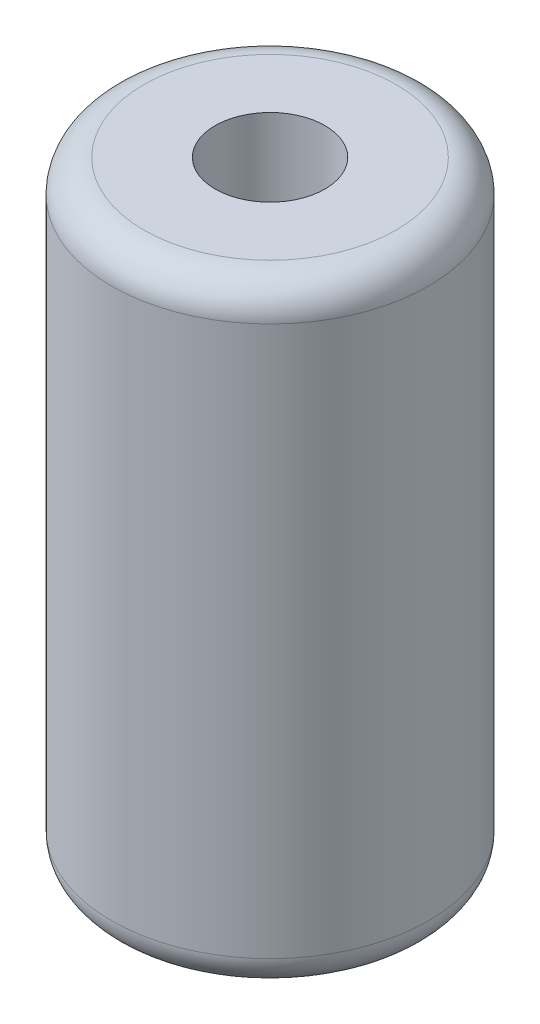
ISO-10303-21;
HEADER;
FILE_DESCRIPTION(('STEP AP214'),'2;1');
FILE_NAME('part.step','',(''),(''),'','','');
FILE_SCHEMA(('AUTOMOTIVE_DESIGN { 1 0 10303 214 1 1 1 1 }'));
ENDSEC;
DATA;
#1=APPLICATION_CONTEXT('core data for automotive mechanical design processes');
#2=APPLICATION_PROTOCOL_DEFINITION('international standard','automotive_design',2000,#1);
#3=PRODUCT_CONTEXT('',#1,'mechanical');
#4=PRODUCT('Part','Part','',(#3));
#5=PRODUCT_RELATED_PRODUCT_CATEGORY('part','',(#4));
#6=PRODUCT_DEFINITION_FORMATION('','',#4);
#7=PRODUCT_DEFINITION_CONTEXT('part definition',#1,'design');
#8=PRODUCT_DEFINITION('design','',#6,#7);
#9=PRODUCT_DEFINITION_SHAPE('','',#8);
#10=(LENGTH_UNIT() NAMED_UNIT(*) SI_UNIT(.MILLI.,.METRE.));
#11=(NAMED_UNIT(*) PLANE_ANGLE_UNIT() SI_UNIT($,.RADIAN.));
#12=(NAMED_UNIT(*) SI_UNIT($,.STERADIAN.) SOLID_ANGLE_UNIT());
#13=UNCERTAINTY_MEASURE_WITH_UNIT(LENGTH_MEASURE(1.E-05),#10,'distance_accuracy_value','');
#14=(GEOMETRIC_REPRESENTATION_CONTEXT(3) GLOBAL_UNCERTAINTY_ASSIGNED_CONTEXT((#13)) GLOBAL_UNIT_ASSIGNED_CONTEXT((#10,
#11,#12)) REPRESENTATION_CONTEXT('',''));
#15=CARTESIAN_POINT('',(0.,0.,0.));
#16=DIRECTION('',(0.,0.,1.));
#17=DIRECTION('',(1.,0.,0.));
#18=AXIS2_PLACEMENT_3D('',#15,#16,#17);
#19=CARTESIAN_POINT('',(0.,19.,0.));
#20=DIRECTION('',(0.,1.,0.));
#21=DIRECTION('',(0.,0.,1.));
#22=AXIS2_PLACEMENT_3D('',#19,#20,#21);
#23=PLANE('',#22);
#24=CARTESIAN_POINT('',(0.,19.,0.));
#25=DIRECTION('',(0.,1.,0.));
#26=DIRECTION('',(0.,0.,1.));
#27=AXIS2_PLACEMENT_3D('',#24,#25,#26);
#28=CIRCLE('',#27,3.9);
#29=CARTESIAN_POINT('',(0.,19.,3.9));
#30=VERTEX_POINT('',#29);
#31=EDGE_CURVE('E10',#30,#30,#28,.T.);
#32=ORIENTED_EDGE('',*,*,#31,.T.);
#33=EDGE_LOOP('',(#32));
#34=FACE_BOUND('',#33,.T.);
#35=CARTESIAN_POINT('',(0.,19.,0.));
#36=DIRECTION('',(0.,1.,0.));
#37=DIRECTION('',(0.,0.,1.));
#38=AXIS2_PLACEMENT_3D('',#35,#36,#37);
#39=CIRCLE('',#38,1.7);
#40=CARTESIAN_POINT('',(0.,19.,1.7));
#41=VERTEX_POINT('',#40);
#42=EDGE_CURVE('E67',#41,#41,#39,.T.);
#43=ORIENTED_EDGE('',*,*,#42,.F.);
#44=EDGE_LOOP('',(#43));
#45=FACE_BOUND('',#44,.T.);
#46=ADVANCED_FACE('F43',(#34,#45),#23,.T.);
#47=CARTESIAN_POINT('',(0.,0.,0.));
#48=DIRECTION('',(0.,1.,0.));
#49=DIRECTION('',(0.,0.,1.));
#50=AXIS2_PLACEMENT_3D('',#47,#48,#49);
#51=PLANE('',#50);
#52=CARTESIAN_POINT('',(0.,0.,0.));
#53=DIRECTION('',(0.,1.,0.));
#54=DIRECTION('',(0.,0.,1.));
#55=AXIS2_PLACEMENT_3D('',#52,#53,#54);
#56=CIRCLE('',#55,3.9);
#57=CARTESIAN_POINT('',(0.,0.,3.9));
#58=VERTEX_POINT('',#57);
#59=EDGE_CURVE('E51',#58,#58,#56,.F.);
#60=ORIENTED_EDGE('',*,*,#59,.T.);
#61=EDGE_LOOP('',(#60));
#62=FACE_BOUND('',#61,.T.);
#63=CARTESIAN_POINT('',(0.,0.,0.));
#64=DIRECTION('',(0.,1.,0.));
#65=DIRECTION('',(0.,0.,1.));
#66=AXIS2_PLACEMENT_3D('',#63,#64,#65);
#67=CIRCLE('',#66,1.7);
#68=CARTESIAN_POINT('',(0.,0.,1.7));
#69=VERTEX_POINT('',#68);
#70=EDGE_CURVE('E68',#69,#69,#67,.T.);
#71=ORIENTED_EDGE('',*,*,#70,.T.);
#72=EDGE_LOOP('',(#71));
#73=FACE_BOUND('',#72,.T.);
#74=ADVANCED_FACE('F80',(#62,#73),#51,.F.);
#75=CARTESIAN_POINT('',(0.,19.,0.));
#76=DIRECTION('',(0.,-1.,0.));
#77=DIRECTION('',(0.,0.,-1.));
#78=AXIS2_PLACEMENT_3D('',#75,#76,#77);
#79=CYLINDRICAL_SURFACE('',#78,4.9);
#80=CARTESIAN_POINT('',(0.,1.,0.));
#81=DIRECTION('',(0.,1.,0.));
#82=DIRECTION('',(0.,0.,1.));
#83=AXIS2_PLACEMENT_3D('',#80,#81,#82);
#84=CIRCLE('',#83,4.9);
#85=CARTESIAN_POINT('',(0.,1.,4.9));
#86=VERTEX_POINT('',#85);
#87=EDGE_CURVE('E56',#86,#86,#84,.T.);
#88=ORIENTED_EDGE('',*,*,#87,.T.);
#89=EDGE_LOOP('',(#88));
#90=FACE_BOUND('',#89,.T.);
#91=CARTESIAN_POINT('',(0.,18.,0.));
#92=DIRECTION('',(0.,1.,0.));
#93=DIRECTION('',(0.,0.,1.));
#94=AXIS2_PLACEMENT_3D('',#91,#92,#93);
#95=CIRCLE('',#94,4.9);
#96=CARTESIAN_POINT('',(0.,18.,4.9));
#97=VERTEX_POINT('',#96);
#98=EDGE_CURVE('E61',#97,#97,#95,.F.);
#99=ORIENTED_EDGE('',*,*,#98,.T.);
#100=EDGE_LOOP('',(#99));
#101=FACE_BOUND('',#100,.T.);
#102=ADVANCED_FACE('F86',(#90,#101),#79,.T.);
#103=CARTESIAN_POINT('',(0.,19.,0.));
#104=DIRECTION('',(0.,-1.,0.));
#105=DIRECTION('',(0.,0.,-1.));
#106=AXIS2_PLACEMENT_3D('',#103,#104,#105);
#107=CYLINDRICAL_SURFACE('',#106,1.7);
#108=ORIENTED_EDGE('',*,*,#42,.T.);
#109=EDGE_LOOP('',(#108));
#110=FACE_BOUND('',#109,.T.);
#111=ORIENTED_EDGE('',*,*,#70,.F.);
#112=EDGE_LOOP('',(#111));
#113=FACE_BOUND('',#112,.T.);
#114=ADVANCED_FACE('F76',(#110,#113),#107,.F.);
#115=CARTESIAN_POINT('',(0.,1.,0.));
#116=DIRECTION('',(0.,1.,0.));
#117=DIRECTION('',(0.,0.,1.));
#118=AXIS2_PLACEMENT_3D('',#115,#116,#117);
#119=TOROIDAL_SURFACE('',#118,3.9,1.);
#120=ORIENTED_EDGE('',*,*,#59,.F.);
#121=EDGE_LOOP('',(#120));
#122=FACE_BOUND('',#121,.T.);
#123=ORIENTED_EDGE('',*,*,#87,.F.);
#124=EDGE_LOOP('',(#123));
#125=FACE_BOUND('',#124,.T.);
#126=ADVANCED_FACE('F92',(#122,#125),#119,.T.);
#127=CARTESIAN_POINT('',(0.,18.,0.));
#128=DIRECTION('',(0.,1.,0.));
#129=DIRECTION('',(0.,0.,1.));
#130=AXIS2_PLACEMENT_3D('',#127,#128,#129);
#131=TOROIDAL_SURFACE('',#130,3.9,1.);
#132=ORIENTED_EDGE('',*,*,#98,.F.);
#133=EDGE_LOOP('',(#132));
#134=FACE_BOUND('',#133,.T.);
#135=ORIENTED_EDGE('',*,*,#31,.F.);
#136=EDGE_LOOP('',(#135));
#137=FACE_BOUND('',#136,.T.);
#138=ADVANCED_FACE('F45',(#134,#137),#131,.T.);
#139=CLOSED_SHELL('',(#46,#74,#102,#114,#126,#138));
#140=MANIFOLD_SOLID_BREP('B2',#139);
#141=ADVANCED_BREP_SHAPE_REPRESENTATION('',(#18,#140),#14);
#142=SHAPE_DEFINITION_REPRESENTATION(#9,#141);
ENDSEC;
END-ISO-10303-21;
